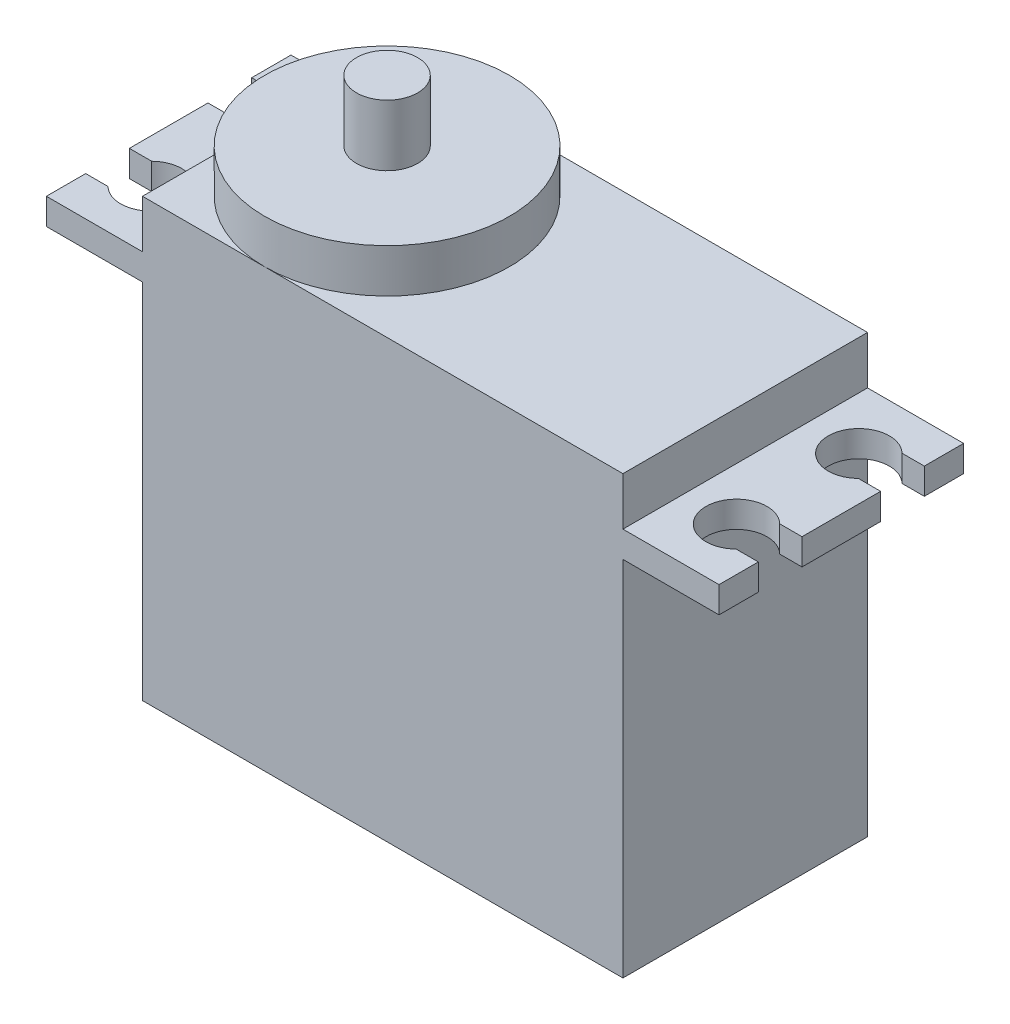
ISO-10303-21;
HEADER;
FILE_DESCRIPTION(('STEP AP214'),'2;1');
FILE_NAME('part.step','',(''),(''),'','','');
FILE_SCHEMA(('AUTOMOTIVE_DESIGN { 1 0 10303 214 1 1 1 1 }'));
ENDSEC;
DATA;
#1=APPLICATION_CONTEXT('core data for automotive mechanical design processes');
#2=APPLICATION_PROTOCOL_DEFINITION('international standard','automotive_design',2000,#1);
#3=PRODUCT_CONTEXT('',#1,'mechanical');
#4=PRODUCT('Part','Part','',(#3));
#5=PRODUCT_RELATED_PRODUCT_CATEGORY('part','',(#4));
#6=PRODUCT_DEFINITION_FORMATION('','',#4);
#7=PRODUCT_DEFINITION_CONTEXT('part definition',#1,'design');
#8=PRODUCT_DEFINITION('design','',#6,#7);
#9=PRODUCT_DEFINITION_SHAPE('','',#8);
#10=(LENGTH_UNIT() NAMED_UNIT(*) SI_UNIT(.MILLI.,.METRE.));
#11=(NAMED_UNIT(*) PLANE_ANGLE_UNIT() SI_UNIT($,.RADIAN.));
#12=(NAMED_UNIT(*) SI_UNIT($,.STERADIAN.) SOLID_ANGLE_UNIT());
#13=UNCERTAINTY_MEASURE_WITH_UNIT(LENGTH_MEASURE(1.E-05),#10,'distance_accuracy_value','');
#14=(GEOMETRIC_REPRESENTATION_CONTEXT(3) GLOBAL_UNCERTAINTY_ASSIGNED_CONTEXT((#13)) GLOBAL_UNIT_ASSIGNED_CONTEXT((#10,
#11,#12)) REPRESENTATION_CONTEXT('',''));
#15=CARTESIAN_POINT('',(0.,0.,0.));
#16=DIRECTION('',(0.,0.,1.));
#17=DIRECTION('',(1.,0.,0.));
#18=AXIS2_PLACEMENT_3D('',#15,#16,#17);
#19=CARTESIAN_POINT('',(-38.5,44.5,14.));
#20=DIRECTION('',(1.,0.,0.));
#21=DIRECTION('',(0.,0.,-1.));
#22=AXIS2_PLACEMENT_3D('',#19,#20,#21);
#23=PLANE('',#22);
#24=DIRECTION('',(0.,-1.,0.));
#25=VECTOR('',#24,1.);
#26=CARTESIAN_POINT('',(-38.5,44.5,-9.5));
#27=LINE('',#26,#25);
#28=CARTESIAN_POINT('',(-38.5,44.5,-9.5));
#29=VERTEX_POINT('',#28);
#30=CARTESIAN_POINT('',(-38.5,41.5,-9.5));
#31=VERTEX_POINT('',#30);
#32=EDGE_CURVE('E248',#29,#31,#27,.T.);
#33=ORIENTED_EDGE('',*,*,#32,.F.);
#34=DIRECTION('',(0.,0.,1.));
#35=VECTOR('',#34,1.);
#36=CARTESIAN_POINT('',(-38.5,44.5,14.));
#37=LINE('',#36,#35);
#38=CARTESIAN_POINT('',(-38.5,44.5,-14.));
#39=VERTEX_POINT('',#38);
#40=EDGE_CURVE('E253',#39,#29,#37,.T.);
#41=ORIENTED_EDGE('',*,*,#40,.F.);
#42=DIRECTION('',(0.,-1.,0.));
#43=VECTOR('',#42,1.);
#44=CARTESIAN_POINT('',(-38.5,44.5,-14.));
#45=LINE('',#44,#43);
#46=CARTESIAN_POINT('',(-38.5,41.5,-14.));
#47=VERTEX_POINT('',#46);
#48=EDGE_CURVE('E371',#39,#47,#45,.T.);
#49=ORIENTED_EDGE('',*,*,#48,.T.);
#50=DIRECTION('',(0.,0.,1.));
#51=VECTOR('',#50,1.);
#52=CARTESIAN_POINT('',(-38.5,41.5,14.));
#53=LINE('',#52,#51);
#54=EDGE_CURVE('E363',#47,#31,#53,.T.);
#55=ORIENTED_EDGE('',*,*,#54,.T.);
#56=EDGE_LOOP('',(#33,#41,#49,#55));
#57=FACE_BOUND('',#56,.T.);
#58=ADVANCED_FACE('F33',(#57),#23,.F.);
#59=DIRECTION('',(0.,-1.,0.));
#60=VECTOR('',#59,1.);
#61=CARTESIAN_POINT('',(-38.5,44.5,-4.5));
#62=LINE('',#61,#60);
#63=CARTESIAN_POINT('',(-38.5,44.5,-4.5));
#64=VERTEX_POINT('',#63);
#65=CARTESIAN_POINT('',(-38.5,41.5,-4.5));
#66=VERTEX_POINT('',#65);
#67=EDGE_CURVE('E263',#64,#66,#62,.T.);
#68=ORIENTED_EDGE('',*,*,#67,.T.);
#69=CARTESIAN_POINT('',(-38.5,41.5,4.5));
#70=VERTEX_POINT('',#69);
#71=EDGE_CURVE('E366',#66,#70,#53,.T.);
#72=ORIENTED_EDGE('',*,*,#71,.T.);
#73=DIRECTION('',(0.,-1.,0.));
#74=VECTOR('',#73,1.);
#75=CARTESIAN_POINT('',(-38.5,44.5,4.5));
#76=LINE('',#75,#74);
#77=CARTESIAN_POINT('',(-38.5,44.5,4.5));
#78=VERTEX_POINT('',#77);
#79=EDGE_CURVE('E286',#78,#70,#76,.T.);
#80=ORIENTED_EDGE('',*,*,#79,.F.);
#81=EDGE_CURVE('E355',#64,#78,#37,.T.);
#82=ORIENTED_EDGE('',*,*,#81,.F.);
#83=EDGE_LOOP('',(#68,#72,#80,#82));
#84=FACE_BOUND('',#83,.T.);
#85=ADVANCED_FACE('F549',(#84),#23,.F.);
#86=CARTESIAN_POINT('',(0.,44.5,0.));
#87=DIRECTION('',(0.,1.,0.));
#88=DIRECTION('',(0.,0.,1.));
#89=AXIS2_PLACEMENT_3D('',#86,#87,#88);
#90=PLANE('',#89);
#91=ORIENTED_EDGE('',*,*,#40,.T.);
#92=DIRECTION('',(-1.,0.,0.));
#93=VECTOR('',#92,1.);
#94=CARTESIAN_POINT('',(-35.9494897427832,44.5,-9.5));
#95=LINE('',#94,#93);
#96=CARTESIAN_POINT('',(-35.9494897427832,44.5,-9.5));
#97=VERTEX_POINT('',#96);
#98=EDGE_CURVE('E240',#97,#29,#95,.T.);
#99=ORIENTED_EDGE('',*,*,#98,.F.);
#100=CARTESIAN_POINT('',(-33.5,44.5,-7.));
#101=DIRECTION('',(0.,1.,0.));
#102=DIRECTION('',(0.,0.,-1.));
#103=AXIS2_PLACEMENT_3D('',#100,#101,#102);
#104=CIRCLE('',#103,3.5);
#105=CARTESIAN_POINT('',(-35.9494897427832,44.5,-4.5));
#106=VERTEX_POINT('',#105);
#107=EDGE_CURVE('E232',#106,#97,#104,.T.);
#108=ORIENTED_EDGE('',*,*,#107,.F.);
#109=DIRECTION('',(1.,0.,0.));
#110=VECTOR('',#109,1.);
#111=CARTESIAN_POINT('',(-35.9494897427832,44.5,-4.5));
#112=LINE('',#111,#110);
#113=EDGE_CURVE('E254',#64,#106,#112,.T.);
#114=ORIENTED_EDGE('',*,*,#113,.F.);
#115=ORIENTED_EDGE('',*,*,#81,.T.);
#116=DIRECTION('',(-1.,0.,0.));
#117=VECTOR('',#116,1.);
#118=CARTESIAN_POINT('',(-35.9494897427832,44.5,4.5));
#119=LINE('',#118,#117);
#120=CARTESIAN_POINT('',(-35.9494897427832,44.5,4.5));
#121=VERTEX_POINT('',#120);
#122=EDGE_CURVE('E269',#121,#78,#119,.T.);
#123=ORIENTED_EDGE('',*,*,#122,.F.);
#124=CARTESIAN_POINT('',(-33.5,44.5,7.));
#125=DIRECTION('',(0.,1.,0.));
#126=DIRECTION('',(0.,0.,1.));
#127=AXIS2_PLACEMENT_3D('',#124,#125,#126);
#128=CIRCLE('',#127,3.5);
#129=CARTESIAN_POINT('',(-35.9494897427832,44.5,9.5));
#130=VERTEX_POINT('',#129);
#131=EDGE_CURVE('E267',#130,#121,#128,.T.);
#132=ORIENTED_EDGE('',*,*,#131,.F.);
#133=DIRECTION('',(1.,0.,0.));
#134=VECTOR('',#133,1.);
#135=CARTESIAN_POINT('',(-35.9494897427832,44.5,9.5));
#136=LINE('',#135,#134);
#137=CARTESIAN_POINT('',(-38.5,44.5,9.5));
#138=VERTEX_POINT('',#137);
#139=EDGE_CURVE('E273',#138,#130,#136,.T.);
#140=ORIENTED_EDGE('',*,*,#139,.F.);
#141=CARTESIAN_POINT('',(-38.5,44.5,14.));
#142=VERTEX_POINT('',#141);
#143=EDGE_CURVE('E352',#138,#142,#37,.T.);
#144=ORIENTED_EDGE('',*,*,#143,.T.);
#145=DIRECTION('',(1.,0.,0.));
#146=VECTOR('',#145,1.);
#147=CARTESIAN_POINT('',(-27.5,44.5,14.));
#148=LINE('',#147,#146);
#149=CARTESIAN_POINT('',(-27.5,44.5,14.));
#150=VERTEX_POINT('',#149);
#151=EDGE_CURVE('E354',#142,#150,#148,.T.);
#152=ORIENTED_EDGE('',*,*,#151,.T.);
#153=DIRECTION('',(0.,0.,-1.));
#154=VECTOR('',#153,1.);
#155=CARTESIAN_POINT('',(-27.5,44.5,14.));
#156=LINE('',#155,#154);
#157=CARTESIAN_POINT('',(-27.5,44.5,-14.));
#158=VERTEX_POINT('',#157);
#159=EDGE_CURVE('E346',#150,#158,#156,.T.);
#160=ORIENTED_EDGE('',*,*,#159,.T.);
#161=DIRECTION('',(-1.,0.,0.));
#162=VECTOR('',#161,1.);
#163=CARTESIAN_POINT('',(-27.5,44.5,-14.));
#164=LINE('',#163,#162);
#165=EDGE_CURVE('E349',#158,#39,#164,.T.);
#166=ORIENTED_EDGE('',*,*,#165,.T.);
#167=EDGE_LOOP('',(#91,#99,#108,#114,#115,#123,#132,#140,#144,#152,#160,#166));
#168=FACE_BOUND('',#167,.T.);
#169=ADVANCED_FACE('F251',(#168),#90,.T.);
#170=CARTESIAN_POINT('',(0.,41.5,0.));
#171=DIRECTION('',(0.,1.,0.));
#172=DIRECTION('',(0.,0.,1.));
#173=AXIS2_PLACEMENT_3D('',#170,#171,#172);
#174=PLANE('',#173);
#175=DIRECTION('',(-1.,0.,0.));
#176=VECTOR('',#175,1.);
#177=CARTESIAN_POINT('',(-35.9494897427832,41.5,-9.5));
#178=LINE('',#177,#176);
#179=CARTESIAN_POINT('',(-35.9494897427832,41.5,-9.5));
#180=VERTEX_POINT('',#179);
#181=EDGE_CURVE('E247',#180,#31,#178,.T.);
#182=ORIENTED_EDGE('',*,*,#181,.T.);
#183=ORIENTED_EDGE('',*,*,#54,.F.);
#184=DIRECTION('',(-1.,0.,0.));
#185=VECTOR('',#184,1.);
#186=CARTESIAN_POINT('',(-27.5,41.5,-14.));
#187=LINE('',#186,#185);
#188=CARTESIAN_POINT('',(-27.5,41.5,-14.));
#189=VERTEX_POINT('',#188);
#190=EDGE_CURVE('E360',#189,#47,#187,.T.);
#191=ORIENTED_EDGE('',*,*,#190,.F.);
#192=DIRECTION('',(0.,0.,-1.));
#193=VECTOR('',#192,1.);
#194=CARTESIAN_POINT('',(-27.5,41.5,14.));
#195=LINE('',#194,#193);
#196=CARTESIAN_POINT('',(-27.5,41.5,14.));
#197=VERTEX_POINT('',#196);
#198=EDGE_CURVE('E345',#197,#189,#195,.T.);
#199=ORIENTED_EDGE('',*,*,#198,.F.);
#200=DIRECTION('',(1.,0.,0.));
#201=VECTOR('',#200,1.);
#202=CARTESIAN_POINT('',(-27.5,41.5,14.));
#203=LINE('',#202,#201);
#204=CARTESIAN_POINT('',(-38.5,41.5,14.));
#205=VERTEX_POINT('',#204);
#206=EDGE_CURVE('E350',#205,#197,#203,.T.);
#207=ORIENTED_EDGE('',*,*,#206,.F.);
#208=CARTESIAN_POINT('',(-38.5,41.5,9.5));
#209=VERTEX_POINT('',#208);
#210=EDGE_CURVE('E362',#209,#205,#53,.T.);
#211=ORIENTED_EDGE('',*,*,#210,.F.);
#212=DIRECTION('',(1.,0.,0.));
#213=VECTOR('',#212,1.);
#214=CARTESIAN_POINT('',(-35.9494897427832,41.5,9.5));
#215=LINE('',#214,#213);
#216=CARTESIAN_POINT('',(-35.9494897427832,41.5,9.5));
#217=VERTEX_POINT('',#216);
#218=EDGE_CURVE('E270',#209,#217,#215,.T.);
#219=ORIENTED_EDGE('',*,*,#218,.T.);
#220=CARTESIAN_POINT('',(-33.5,41.5,7.));
#221=DIRECTION('',(0.,1.,0.));
#222=DIRECTION('',(0.,0.,1.));
#223=AXIS2_PLACEMENT_3D('',#220,#221,#222);
#224=CIRCLE('',#223,3.5);
#225=CARTESIAN_POINT('',(-35.9494897427832,41.5,4.5));
#226=VERTEX_POINT('',#225);
#227=EDGE_CURVE('E59',#217,#226,#224,.T.);
#228=ORIENTED_EDGE('',*,*,#227,.T.);
#229=DIRECTION('',(-1.,0.,0.));
#230=VECTOR('',#229,1.);
#231=CARTESIAN_POINT('',(-35.9494897427832,41.5,4.5));
#232=LINE('',#231,#230);
#233=EDGE_CURVE('E277',#226,#70,#232,.T.);
#234=ORIENTED_EDGE('',*,*,#233,.T.);
#235=ORIENTED_EDGE('',*,*,#71,.F.);
#236=DIRECTION('',(1.,0.,0.));
#237=VECTOR('',#236,1.);
#238=CARTESIAN_POINT('',(-35.9494897427832,41.5,-4.5));
#239=LINE('',#238,#237);
#240=CARTESIAN_POINT('',(-35.9494897427832,41.5,-4.5));
#241=VERTEX_POINT('',#240);
#242=EDGE_CURVE('E241',#66,#241,#239,.T.);
#243=ORIENTED_EDGE('',*,*,#242,.T.);
#244=CARTESIAN_POINT('',(-33.5,41.5,-7.));
#245=DIRECTION('',(0.,1.,0.));
#246=DIRECTION('',(0.,0.,-1.));
#247=AXIS2_PLACEMENT_3D('',#244,#245,#246);
#248=CIRCLE('',#247,3.5);
#249=EDGE_CURVE('E51',#241,#180,#248,.T.);
#250=ORIENTED_EDGE('',*,*,#249,.T.);
#251=EDGE_LOOP('',(#182,#183,#191,#199,#207,#211,#219,#228,#234,#235,#243,#250));
#252=FACE_BOUND('',#251,.T.);
#253=ADVANCED_FACE('F560',(#252),#174,.F.);
#254=DIRECTION('',(0.,-1.,0.));
#255=VECTOR('',#254,1.);
#256=CARTESIAN_POINT('',(-38.5,44.5,9.5));
#257=LINE('',#256,#255);
#258=EDGE_CURVE('E283',#138,#209,#257,.T.);
#259=ORIENTED_EDGE('',*,*,#258,.T.);
#260=ORIENTED_EDGE('',*,*,#210,.T.);
#261=DIRECTION('',(0.,-1.,0.));
#262=VECTOR('',#261,1.);
#263=CARTESIAN_POINT('',(-38.5,44.5,14.));
#264=LINE('',#263,#262);
#265=EDGE_CURVE('E357',#142,#205,#264,.T.);
#266=ORIENTED_EDGE('',*,*,#265,.F.);
#267=ORIENTED_EDGE('',*,*,#143,.F.);
#268=EDGE_LOOP('',(#259,#260,#266,#267));
#269=FACE_BOUND('',#268,.T.);
#270=ADVANCED_FACE('F552',(#269),#23,.F.);
#271=CARTESIAN_POINT('',(38.5,44.5,-14.));
#272=DIRECTION('',(-1.,0.,0.));
#273=DIRECTION('',(0.,0.,1.));
#274=AXIS2_PLACEMENT_3D('',#271,#272,#273);
#275=PLANE('',#274);
#276=DIRECTION('',(0.,-1.,0.));
#277=VECTOR('',#276,1.);
#278=CARTESIAN_POINT('',(38.5,44.5,9.5));
#279=LINE('',#278,#277);
#280=CARTESIAN_POINT('',(38.5,44.5,9.5));
#281=VERTEX_POINT('',#280);
#282=CARTESIAN_POINT('',(38.5,41.5,9.5));
#283=VERTEX_POINT('',#282);
#284=EDGE_CURVE('E312',#281,#283,#279,.T.);
#285=ORIENTED_EDGE('',*,*,#284,.F.);
#286=DIRECTION('',(0.,0.,-1.));
#287=VECTOR('',#286,1.);
#288=CARTESIAN_POINT('',(38.5,44.5,-14.));
#289=LINE('',#288,#287);
#290=CARTESIAN_POINT('',(38.5,44.5,14.));
#291=VERTEX_POINT('',#290);
#292=EDGE_CURVE('E377',#291,#281,#289,.T.);
#293=ORIENTED_EDGE('',*,*,#292,.F.);
#294=DIRECTION('',(0.,-1.,0.));
#295=VECTOR('',#294,1.);
#296=CARTESIAN_POINT('',(38.5,44.5,14.));
#297=LINE('',#296,#295);
#298=CARTESIAN_POINT('',(38.5,41.5,14.));
#299=VERTEX_POINT('',#298);
#300=EDGE_CURVE('E408',#291,#299,#297,.T.);
#301=ORIENTED_EDGE('',*,*,#300,.T.);
#302=DIRECTION('',(0.,0.,-1.));
#303=VECTOR('',#302,1.);
#304=CARTESIAN_POINT('',(38.5,41.5,-14.));
#305=LINE('',#304,#303);
#306=EDGE_CURVE('E396',#299,#283,#305,.T.);
#307=ORIENTED_EDGE('',*,*,#306,.T.);
#308=EDGE_LOOP('',(#285,#293,#301,#307));
#309=FACE_BOUND('',#308,.T.);
#310=ADVANCED_FACE('F528',(#309),#275,.F.);
#311=DIRECTION('',(0.,-1.,0.));
#312=VECTOR('',#311,1.);
#313=CARTESIAN_POINT('',(38.5,44.5,4.5));
#314=LINE('',#313,#312);
#315=CARTESIAN_POINT('',(38.5,44.5,4.5));
#316=VERTEX_POINT('',#315);
#317=CARTESIAN_POINT('',(38.5,41.5,4.5));
#318=VERTEX_POINT('',#317);
#319=EDGE_CURVE('E309',#316,#318,#314,.T.);
#320=ORIENTED_EDGE('',*,*,#319,.T.);
#321=CARTESIAN_POINT('',(38.5,41.5,-4.5));
#322=VERTEX_POINT('',#321);
#323=EDGE_CURVE('E404',#318,#322,#305,.T.);
#324=ORIENTED_EDGE('',*,*,#323,.T.);
#325=DIRECTION('',(0.,-1.,0.));
#326=VECTOR('',#325,1.);
#327=CARTESIAN_POINT('',(38.5,44.5,-4.5));
#328=LINE('',#327,#326);
#329=CARTESIAN_POINT('',(38.5,44.5,-4.5));
#330=VERTEX_POINT('',#329);
#331=EDGE_CURVE('E339',#330,#322,#328,.T.);
#332=ORIENTED_EDGE('',*,*,#331,.F.);
#333=EDGE_CURVE('E521',#316,#330,#289,.T.);
#334=ORIENTED_EDGE('',*,*,#333,.F.);
#335=EDGE_LOOP('',(#320,#324,#332,#334));
#336=FACE_BOUND('',#335,.T.);
#337=ADVANCED_FACE('F501',(#336),#275,.F.);
#338=CARTESIAN_POINT('',(0.,44.5,0.));
#339=DIRECTION('',(0.,1.,0.));
#340=DIRECTION('',(0.,0.,1.));
#341=AXIS2_PLACEMENT_3D('',#338,#339,#340);
#342=PLANE('',#341);
#343=ORIENTED_EDGE('',*,*,#292,.T.);
#344=DIRECTION('',(1.,0.,0.));
#345=VECTOR('',#344,1.);
#346=CARTESIAN_POINT('',(35.9494897427832,44.5,9.5));
#347=LINE('',#346,#345);
#348=CARTESIAN_POINT('',(35.9494897427832,44.5,9.5));
#349=VERTEX_POINT('',#348);
#350=EDGE_CURVE('E294',#349,#281,#347,.T.);
#351=ORIENTED_EDGE('',*,*,#350,.F.);
#352=CARTESIAN_POINT('',(33.5,44.5,7.));
#353=DIRECTION('',(0.,1.,0.));
#354=DIRECTION('',(0.,0.,-1.));
#355=AXIS2_PLACEMENT_3D('',#352,#353,#354);
#356=CIRCLE('',#355,3.5);
#357=CARTESIAN_POINT('',(35.9494897427832,44.5,4.5));
#358=VERTEX_POINT('',#357);
#359=EDGE_CURVE('E292',#358,#349,#356,.T.);
#360=ORIENTED_EDGE('',*,*,#359,.F.);
#361=DIRECTION('',(-1.,0.,0.));
#362=VECTOR('',#361,1.);
#363=CARTESIAN_POINT('',(35.9494897427832,44.5,4.5));
#364=LINE('',#363,#362);
#365=EDGE_CURVE('E297',#316,#358,#364,.T.);
#366=ORIENTED_EDGE('',*,*,#365,.F.);
#367=ORIENTED_EDGE('',*,*,#333,.T.);
#368=DIRECTION('',(1.,0.,0.));
#369=VECTOR('',#368,1.);
#370=CARTESIAN_POINT('',(35.9494897427832,44.5,-4.5));
#371=LINE('',#370,#369);
#372=CARTESIAN_POINT('',(35.9494897427832,44.5,-4.5));
#373=VERTEX_POINT('',#372);
#374=EDGE_CURVE('E320',#373,#330,#371,.T.);
#375=ORIENTED_EDGE('',*,*,#374,.F.);
#376=CARTESIAN_POINT('',(33.5,44.5,-7.));
#377=DIRECTION('',(0.,1.,0.));
#378=DIRECTION('',(0.,0.,1.));
#379=AXIS2_PLACEMENT_3D('',#376,#377,#378);
#380=CIRCLE('',#379,3.5);
#381=CARTESIAN_POINT('',(35.9494897427832,44.5,-9.5));
#382=VERTEX_POINT('',#381);
#383=EDGE_CURVE('E318',#382,#373,#380,.T.);
#384=ORIENTED_EDGE('',*,*,#383,.F.);
#385=DIRECTION('',(-1.,0.,0.));
#386=VECTOR('',#385,1.);
#387=CARTESIAN_POINT('',(35.9494897427832,44.5,-9.5));
#388=LINE('',#387,#386);
#389=CARTESIAN_POINT('',(38.5,44.5,-9.5));
#390=VERTEX_POINT('',#389);
#391=EDGE_CURVE('E324',#390,#382,#388,.T.);
#392=ORIENTED_EDGE('',*,*,#391,.F.);
#393=CARTESIAN_POINT('',(38.5,44.5,-14.));
#394=VERTEX_POINT('',#393);
#395=EDGE_CURVE('E518',#390,#394,#289,.T.);
#396=ORIENTED_EDGE('',*,*,#395,.T.);
#397=DIRECTION('',(-1.,0.,0.));
#398=VECTOR('',#397,1.);
#399=CARTESIAN_POINT('',(27.5,44.5,-14.));
#400=LINE('',#399,#398);
#401=CARTESIAN_POINT('',(27.5,44.5,-14.));
#402=VERTEX_POINT('',#401);
#403=EDGE_CURVE('E388',#394,#402,#400,.T.);
#404=ORIENTED_EDGE('',*,*,#403,.T.);
#405=DIRECTION('',(0.,0.,1.));
#406=VECTOR('',#405,1.);
#407=CARTESIAN_POINT('',(27.5,44.5,-14.));
#408=LINE('',#407,#406);
#409=CARTESIAN_POINT('',(27.5,44.5,14.));
#410=VERTEX_POINT('',#409);
#411=EDGE_CURVE('E380',#402,#410,#408,.T.);
#412=ORIENTED_EDGE('',*,*,#411,.T.);
#413=DIRECTION('',(1.,0.,0.));
#414=VECTOR('',#413,1.);
#415=CARTESIAN_POINT('',(27.5,44.5,14.));
#416=LINE('',#415,#414);
#417=EDGE_CURVE('E384',#410,#291,#416,.T.);
#418=ORIENTED_EDGE('',*,*,#417,.T.);
#419=EDGE_LOOP('',(#343,#351,#360,#366,#367,#375,#384,#392,#396,#404,#412,#418));
#420=FACE_BOUND('',#419,.T.);
#421=ADVANCED_FACE('F517',(#420),#342,.T.);
#422=CARTESIAN_POINT('',(0.,41.5,0.));
#423=DIRECTION('',(0.,1.,0.));
#424=DIRECTION('',(0.,0.,1.));
#425=AXIS2_PLACEMENT_3D('',#422,#423,#424);
#426=PLANE('',#425);
#427=DIRECTION('',(1.,0.,0.));
#428=VECTOR('',#427,1.);
#429=CARTESIAN_POINT('',(35.9494897427832,41.5,9.5));
#430=LINE('',#429,#428);
#431=CARTESIAN_POINT('',(35.9494897427832,41.5,9.5));
#432=VERTEX_POINT('',#431);
#433=EDGE_CURVE('E302',#432,#283,#430,.T.);
#434=ORIENTED_EDGE('',*,*,#433,.T.);
#435=ORIENTED_EDGE('',*,*,#306,.F.);
#436=DIRECTION('',(1.,0.,0.));
#437=VECTOR('',#436,1.);
#438=CARTESIAN_POINT('',(27.5,41.5,14.));
#439=LINE('',#438,#437);
#440=CARTESIAN_POINT('',(27.5,41.5,14.));
#441=VERTEX_POINT('',#440);
#442=EDGE_CURVE('E399',#441,#299,#439,.T.);
#443=ORIENTED_EDGE('',*,*,#442,.F.);
#444=DIRECTION('',(0.,0.,1.));
#445=VECTOR('',#444,1.);
#446=CARTESIAN_POINT('',(27.5,41.5,-14.));
#447=LINE('',#446,#445);
#448=CARTESIAN_POINT('',(27.5,41.5,-14.));
#449=VERTEX_POINT('',#448);
#450=EDGE_CURVE('E374',#449,#441,#447,.T.);
#451=ORIENTED_EDGE('',*,*,#450,.F.);
#452=DIRECTION('',(-1.,0.,0.));
#453=VECTOR('',#452,1.);
#454=CARTESIAN_POINT('',(27.5,41.5,-14.));
#455=LINE('',#454,#453);
#456=CARTESIAN_POINT('',(38.5,41.5,-14.));
#457=VERTEX_POINT('',#456);
#458=EDGE_CURVE('E385',#457,#449,#455,.T.);
#459=ORIENTED_EDGE('',*,*,#458,.F.);
#460=CARTESIAN_POINT('',(38.5,41.5,-9.5));
#461=VERTEX_POINT('',#460);
#462=EDGE_CURVE('E405',#461,#457,#305,.T.);
#463=ORIENTED_EDGE('',*,*,#462,.F.);
#464=DIRECTION('',(-1.,0.,0.));
#465=VECTOR('',#464,1.);
#466=CARTESIAN_POINT('',(35.9494897427832,41.5,-9.5));
#467=LINE('',#466,#465);
#468=CARTESIAN_POINT('',(35.9494897427832,41.5,-9.5));
#469=VERTEX_POINT('',#468);
#470=EDGE_CURVE('E321',#461,#469,#467,.T.);
#471=ORIENTED_EDGE('',*,*,#470,.T.);
#472=CARTESIAN_POINT('',(33.5,41.5,-7.));
#473=DIRECTION('',(0.,1.,0.));
#474=DIRECTION('',(0.,0.,1.));
#475=AXIS2_PLACEMENT_3D('',#472,#473,#474);
#476=CIRCLE('',#475,3.5);
#477=CARTESIAN_POINT('',(35.9494897427832,41.5,-4.5));
#478=VERTEX_POINT('',#477);
#479=EDGE_CURVE('E317',#469,#478,#476,.T.);
#480=ORIENTED_EDGE('',*,*,#479,.T.);
#481=DIRECTION('',(1.,0.,0.));
#482=VECTOR('',#481,1.);
#483=CARTESIAN_POINT('',(35.9494897427832,41.5,-4.5));
#484=LINE('',#483,#482);
#485=EDGE_CURVE('E329',#478,#322,#484,.T.);
#486=ORIENTED_EDGE('',*,*,#485,.T.);
#487=ORIENTED_EDGE('',*,*,#323,.F.);
#488=DIRECTION('',(-1.,0.,0.));
#489=VECTOR('',#488,1.);
#490=CARTESIAN_POINT('',(35.9494897427832,41.5,4.5));
#491=LINE('',#490,#489);
#492=CARTESIAN_POINT('',(35.9494897427832,41.5,4.5));
#493=VERTEX_POINT('',#492);
#494=EDGE_CURVE('E295',#318,#493,#491,.T.);
#495=ORIENTED_EDGE('',*,*,#494,.T.);
#496=CARTESIAN_POINT('',(33.5,41.5,7.));
#497=DIRECTION('',(0.,1.,0.));
#498=DIRECTION('',(0.,0.,-1.));
#499=AXIS2_PLACEMENT_3D('',#496,#497,#498);
#500=CIRCLE('',#499,3.5);
#501=EDGE_CURVE('E291',#493,#432,#500,.T.);
#502=ORIENTED_EDGE('',*,*,#501,.T.);
#503=EDGE_LOOP('',(#434,#435,#443,#451,#459,#463,#471,#480,#486,#487,#495,#502));
#504=FACE_BOUND('',#503,.T.);
#505=ADVANCED_FACE('F493',(#504),#426,.F.);
#506=DIRECTION('',(0.,-1.,0.));
#507=VECTOR('',#506,1.);
#508=CARTESIAN_POINT('',(38.5,44.5,-9.5));
#509=LINE('',#508,#507);
#510=EDGE_CURVE('E336',#390,#461,#509,.T.);
#511=ORIENTED_EDGE('',*,*,#510,.T.);
#512=ORIENTED_EDGE('',*,*,#462,.T.);
#513=DIRECTION('',(0.,-1.,0.));
#514=VECTOR('',#513,1.);
#515=CARTESIAN_POINT('',(38.5,44.5,-14.));
#516=LINE('',#515,#514);
#517=EDGE_CURVE('E391',#394,#457,#516,.T.);
#518=ORIENTED_EDGE('',*,*,#517,.F.);
#519=ORIENTED_EDGE('',*,*,#395,.F.);
#520=EDGE_LOOP('',(#511,#512,#518,#519));
#521=FACE_BOUND('',#520,.T.);
#522=ADVANCED_FACE('F519',(#521),#275,.F.);
#523=CARTESIAN_POINT('',(-27.5,50.,14.));
#524=DIRECTION('',(-1.,0.,0.));
#525=DIRECTION('',(0.,0.,1.));
#526=AXIS2_PLACEMENT_3D('',#523,#524,#525);
#527=PLANE('',#526);
#528=DIRECTION('',(0.,-1.,0.));
#529=VECTOR('',#528,1.);
#530=CARTESIAN_POINT('',(-27.5,50.,14.));
#531=LINE('',#530,#529);
#532=CARTESIAN_POINT('',(-27.5,0.,14.));
#533=VERTEX_POINT('',#532);
#534=EDGE_CURVE('E457',#197,#533,#531,.T.);
#535=ORIENTED_EDGE('',*,*,#534,.F.);
#536=ORIENTED_EDGE('',*,*,#198,.T.);
#537=DIRECTION('',(0.,-1.,0.));
#538=VECTOR('',#537,1.);
#539=CARTESIAN_POINT('',(-27.5,50.,-14.));
#540=LINE('',#539,#538);
#541=CARTESIAN_POINT('',(-27.5,0.,-14.));
#542=VERTEX_POINT('',#541);
#543=EDGE_CURVE('E466',#189,#542,#540,.T.);
#544=ORIENTED_EDGE('',*,*,#543,.T.);
#545=DIRECTION('',(0.,0.,-1.));
#546=VECTOR('',#545,1.);
#547=CARTESIAN_POINT('',(-27.5,0.,14.));
#548=LINE('',#547,#546);
#549=EDGE_CURVE('E443',#533,#542,#548,.T.);
#550=ORIENTED_EDGE('',*,*,#549,.F.);
#551=EDGE_LOOP('',(#535,#536,#544,#550));
#552=FACE_BOUND('',#551,.T.);
#553=ADVANCED_FACE('F482',(#552),#527,.T.);
#554=CARTESIAN_POINT('',(27.5,50.,14.));
#555=DIRECTION('',(-1.,0.,0.));
#556=DIRECTION('',(0.,0.,1.));
#557=AXIS2_PLACEMENT_3D('',#554,#555,#556);
#558=PLANE('',#557);
#559=ORIENTED_EDGE('',*,*,#411,.F.);
#560=DIRECTION('',(0.,-1.,0.));
#561=VECTOR('',#560,1.);
#562=CARTESIAN_POINT('',(27.5,50.,-14.));
#563=LINE('',#562,#561);
#564=CARTESIAN_POINT('',(27.5,50.,-14.));
#565=VERTEX_POINT('',#564);
#566=EDGE_CURVE('E461',#565,#402,#563,.T.);
#567=ORIENTED_EDGE('',*,*,#566,.F.);
#568=DIRECTION('',(0.,0.,-1.));
#569=VECTOR('',#568,1.);
#570=CARTESIAN_POINT('',(27.5,50.,14.));
#571=LINE('',#570,#569);
#572=CARTESIAN_POINT('',(27.5,50.,14.));
#573=VERTEX_POINT('',#572);
#574=EDGE_CURVE('E422',#573,#565,#571,.T.);
#575=ORIENTED_EDGE('',*,*,#574,.F.);
#576=DIRECTION('',(0.,-1.,0.));
#577=VECTOR('',#576,1.);
#578=CARTESIAN_POINT('',(27.5,50.,14.));
#579=LINE('',#578,#577);
#580=EDGE_CURVE('E455',#573,#410,#579,.T.);
#581=ORIENTED_EDGE('',*,*,#580,.T.);
#582=EDGE_LOOP('',(#559,#567,#575,#581));
#583=FACE_BOUND('',#582,.T.);
#584=ADVANCED_FACE('F604',(#583),#558,.F.);
#585=CARTESIAN_POINT('',(-13.5,55.,0.));
#586=DIRECTION('',(0.,1.,0.));
#587=DIRECTION('',(0.,0.,1.));
#588=AXIS2_PLACEMENT_3D('',#585,#586,#587);
#589=PLANE('',#588);
#590=CARTESIAN_POINT('',(-13.5,55.,0.));
#591=DIRECTION('',(0.,1.,0.));
#592=DIRECTION('',(0.,0.,1.));
#593=AXIS2_PLACEMENT_3D('',#590,#591,#592);
#594=CIRCLE('',#593,14.);
#595=CARTESIAN_POINT('',(-13.5,55.,14.));
#596=VERTEX_POINT('',#595);
#597=EDGE_CURVE('E417',#596,#596,#594,.T.);
#598=ORIENTED_EDGE('',*,*,#597,.T.);
#599=EDGE_LOOP('',(#598));
#600=FACE_BOUND('',#599,.T.);
#601=CARTESIAN_POINT('',(-13.5,55.,0.));
#602=DIRECTION('',(0.,1.,0.));
#603=DIRECTION('',(0.,0.,1.));
#604=AXIS2_PLACEMENT_3D('',#601,#602,#603);
#605=CIRCLE('',#604,3.5);
#606=CARTESIAN_POINT('',(-13.5,55.,3.5));
#607=VERTEX_POINT('',#606);
#608=EDGE_CURVE('E411',#607,#607,#605,.T.);
#609=ORIENTED_EDGE('',*,*,#608,.F.);
#610=EDGE_LOOP('',(#609));
#611=FACE_BOUND('',#610,.T.);
#612=ADVANCED_FACE('F635',(#600,#611),#589,.T.);
#613=CARTESIAN_POINT('',(0.,50.,0.));
#614=DIRECTION('',(0.,1.,0.));
#615=DIRECTION('',(0.,0.,1.));
#616=AXIS2_PLACEMENT_3D('',#613,#614,#615);
#617=PLANE('',#616);
#618=CARTESIAN_POINT('',(-13.5,50.,0.));
#619=DIRECTION('',(0.,1.,0.));
#620=DIRECTION('',(0.,0.,1.));
#621=AXIS2_PLACEMENT_3D('',#618,#619,#620);
#622=CIRCLE('',#621,14.);
#623=CARTESIAN_POINT('',(-13.5,50.,14.));
#624=VERTEX_POINT('',#623);
#625=CARTESIAN_POINT('',(-13.5,50.,-14.));
#626=VERTEX_POINT('',#625);
#627=EDGE_CURVE('E44',#624,#626,#622,.T.);
#628=ORIENTED_EDGE('',*,*,#627,.F.);
#629=DIRECTION('',(-1.,0.,0.));
#630=VECTOR('',#629,1.);
#631=CARTESIAN_POINT('',(27.5,50.,14.));
#632=LINE('',#631,#630);
#633=EDGE_CURVE('E435',#573,#624,#632,.T.);
#634=ORIENTED_EDGE('',*,*,#633,.F.);
#635=ORIENTED_EDGE('',*,*,#574,.T.);
#636=DIRECTION('',(-1.,0.,0.));
#637=VECTOR('',#636,1.);
#638=CARTESIAN_POINT('',(27.5,50.,-14.));
#639=LINE('',#638,#637);
#640=EDGE_CURVE('E427',#565,#626,#639,.T.);
#641=ORIENTED_EDGE('',*,*,#640,.T.);
#642=EDGE_LOOP('',(#628,#634,#635,#641));
#643=FACE_BOUND('',#642,.T.);
#644=ADVANCED_FACE('F615',(#643),#617,.T.);
#645=CARTESIAN_POINT('',(-27.5,50.,0.));
#646=VERTEX_POINT('',#645);
#647=EDGE_CURVE('E11',#626,#646,#622,.T.);
#648=ORIENTED_EDGE('',*,*,#647,.F.);
#649=CARTESIAN_POINT('',(-27.5,50.,-14.));
#650=VERTEX_POINT('',#649);
#651=EDGE_CURVE('E425',#626,#650,#639,.T.);
#652=ORIENTED_EDGE('',*,*,#651,.T.);
#653=DIRECTION('',(0.,0.,-1.));
#654=VECTOR('',#653,1.);
#655=CARTESIAN_POINT('',(-27.5,50.,14.));
#656=LINE('',#655,#654);
#657=EDGE_CURVE('E430',#646,#650,#656,.T.);
#658=ORIENTED_EDGE('',*,*,#657,.F.);
#659=EDGE_LOOP('',(#648,#652,#658));
#660=FACE_BOUND('',#659,.T.);
#661=ADVANCED_FACE('F621',(#660),#617,.T.);
#662=CARTESIAN_POINT('',(27.5,0.,-14.));
#663=VERTEX_POINT('',#662);
#664=EDGE_CURVE('E458',#449,#663,#563,.T.);
#665=ORIENTED_EDGE('',*,*,#664,.F.);
#666=ORIENTED_EDGE('',*,*,#450,.T.);
#667=CARTESIAN_POINT('',(27.5,0.,14.));
#668=VERTEX_POINT('',#667);
#669=EDGE_CURVE('E437',#441,#668,#579,.T.);
#670=ORIENTED_EDGE('',*,*,#669,.T.);
#671=DIRECTION('',(0.,0.,-1.));
#672=VECTOR('',#671,1.);
#673=CARTESIAN_POINT('',(27.5,0.,14.));
#674=LINE('',#673,#672);
#675=EDGE_CURVE('E419',#668,#663,#674,.T.);
#676=ORIENTED_EDGE('',*,*,#675,.T.);
#677=EDGE_LOOP('',(#665,#666,#670,#676));
#678=FACE_BOUND('',#677,.T.);
#679=ADVANCED_FACE('F35',(#678),#558,.F.);
#680=CARTESIAN_POINT('',(27.5,50.,-14.));
#681=DIRECTION('',(0.,0.,1.));
#682=DIRECTION('',(1.,0.,0.));
#683=AXIS2_PLACEMENT_3D('',#680,#681,#682);
#684=PLANE('',#683);
#685=DIRECTION('',(-1.,0.,0.));
#686=VECTOR('',#685,1.);
#687=CARTESIAN_POINT('',(27.5,0.,-14.));
#688=LINE('',#687,#686);
#689=EDGE_CURVE('E440',#663,#542,#688,.T.);
#690=ORIENTED_EDGE('',*,*,#689,.T.);
#691=ORIENTED_EDGE('',*,*,#543,.F.);
#692=ORIENTED_EDGE('',*,*,#190,.T.);
#693=ORIENTED_EDGE('',*,*,#48,.F.);
#694=ORIENTED_EDGE('',*,*,#165,.F.);
#695=EDGE_CURVE('E462',#650,#158,#540,.T.);
#696=ORIENTED_EDGE('',*,*,#695,.F.);
#697=ORIENTED_EDGE('',*,*,#651,.F.);
#698=ORIENTED_EDGE('',*,*,#640,.F.);
#699=ORIENTED_EDGE('',*,*,#566,.T.);
#700=ORIENTED_EDGE('',*,*,#403,.F.);
#701=ORIENTED_EDGE('',*,*,#517,.T.);
#702=ORIENTED_EDGE('',*,*,#458,.T.);
#703=ORIENTED_EDGE('',*,*,#664,.T.);
#704=EDGE_LOOP('',(#690,#691,#692,#693,#694,#696,#697,#698,#699,#700,#701,#702,#703));
#705=FACE_BOUND('',#704,.T.);
#706=ADVANCED_FACE('F600',(#705),#684,.F.);
#707=ORIENTED_EDGE('',*,*,#159,.F.);
#708=CARTESIAN_POINT('',(-27.5,50.,14.));
#709=VERTEX_POINT('',#708);
#710=EDGE_CURVE('E450',#709,#150,#531,.T.);
#711=ORIENTED_EDGE('',*,*,#710,.F.);
#712=EDGE_CURVE('E431',#709,#646,#656,.T.);
#713=ORIENTED_EDGE('',*,*,#712,.T.);
#714=ORIENTED_EDGE('',*,*,#657,.T.);
#715=ORIENTED_EDGE('',*,*,#695,.T.);
#716=EDGE_LOOP('',(#707,#711,#713,#714,#715));
#717=FACE_BOUND('',#716,.T.);
#718=ADVANCED_FACE('F622',(#717),#527,.T.);
#719=CARTESIAN_POINT('',(27.5,50.,14.));
#720=DIRECTION('',(0.,0.,1.));
#721=DIRECTION('',(1.,0.,0.));
#722=AXIS2_PLACEMENT_3D('',#719,#720,#721);
#723=PLANE('',#722);
#724=DIRECTION('',(-1.,0.,0.));
#725=VECTOR('',#724,1.);
#726=CARTESIAN_POINT('',(27.5,0.,14.));
#727=LINE('',#726,#725);
#728=EDGE_CURVE('E426',#668,#533,#727,.T.);
#729=ORIENTED_EDGE('',*,*,#728,.F.);
#730=ORIENTED_EDGE('',*,*,#669,.F.);
#731=ORIENTED_EDGE('',*,*,#442,.T.);
#732=ORIENTED_EDGE('',*,*,#300,.F.);
#733=ORIENTED_EDGE('',*,*,#417,.F.);
#734=ORIENTED_EDGE('',*,*,#580,.F.);
#735=ORIENTED_EDGE('',*,*,#633,.T.);
#736=EDGE_CURVE('E434',#624,#709,#632,.T.);
#737=ORIENTED_EDGE('',*,*,#736,.T.);
#738=ORIENTED_EDGE('',*,*,#710,.T.);
#739=ORIENTED_EDGE('',*,*,#151,.F.);
#740=ORIENTED_EDGE('',*,*,#265,.T.);
#741=ORIENTED_EDGE('',*,*,#206,.T.);
#742=ORIENTED_EDGE('',*,*,#534,.T.);
#743=EDGE_LOOP('',(#729,#730,#731,#732,#733,#734,#735,#737,#738,#739,#740,#741,#742));
#744=FACE_BOUND('',#743,.T.);
#745=ADVANCED_FACE('F479',(#744),#723,.T.);
#746=EDGE_CURVE('E42',#646,#624,#622,.T.);
#747=ORIENTED_EDGE('',*,*,#746,.F.);
#748=ORIENTED_EDGE('',*,*,#712,.F.);
#749=ORIENTED_EDGE('',*,*,#736,.F.);
#750=EDGE_LOOP('',(#747,#748,#749));
#751=FACE_BOUND('',#750,.T.);
#752=ADVANCED_FACE('F612',(#751),#617,.T.);
#753=CARTESIAN_POINT('',(0.,0.,0.));
#754=DIRECTION('',(0.,1.,0.));
#755=DIRECTION('',(0.,0.,1.));
#756=AXIS2_PLACEMENT_3D('',#753,#754,#755);
#757=PLANE('',#756);
#758=ORIENTED_EDGE('',*,*,#675,.F.);
#759=ORIENTED_EDGE('',*,*,#728,.T.);
#760=ORIENTED_EDGE('',*,*,#549,.T.);
#761=ORIENTED_EDGE('',*,*,#689,.F.);
#762=EDGE_LOOP('',(#758,#759,#760,#761));
#763=FACE_BOUND('',#762,.T.);
#764=ADVANCED_FACE('F486',(#763),#757,.F.);
#765=CARTESIAN_POINT('',(-13.5,55.,0.));
#766=DIRECTION('',(0.,-1.,0.));
#767=DIRECTION('',(0.,0.,-1.));
#768=AXIS2_PLACEMENT_3D('',#765,#766,#767);
#769=CYLINDRICAL_SURFACE('',#768,14.);
#770=ORIENTED_EDGE('',*,*,#597,.F.);
#771=EDGE_LOOP('',(#770));
#772=FACE_BOUND('',#771,.T.);
#773=ORIENTED_EDGE('',*,*,#627,.T.);
#774=ORIENTED_EDGE('',*,*,#647,.T.);
#775=ORIENTED_EDGE('',*,*,#746,.T.);
#776=EDGE_LOOP('',(#773,#774,#775));
#777=FACE_BOUND('',#776,.T.);
#778=ADVANCED_FACE('F617',(#772,#777),#769,.T.);
#779=CARTESIAN_POINT('',(-13.5,62.,0.));
#780=DIRECTION('',(0.,-1.,0.));
#781=DIRECTION('',(0.,0.,-1.));
#782=AXIS2_PLACEMENT_3D('',#779,#780,#781);
#783=CYLINDRICAL_SURFACE('',#782,3.5);
#784=CARTESIAN_POINT('',(-13.5,62.,0.));
#785=DIRECTION('',(0.,1.,0.));
#786=DIRECTION('',(0.,0.,1.));
#787=AXIS2_PLACEMENT_3D('',#784,#785,#786);
#788=CIRCLE('',#787,3.5);
#789=CARTESIAN_POINT('',(-13.5,62.,3.5));
#790=VERTEX_POINT('',#789);
#791=EDGE_CURVE('E412',#790,#790,#788,.T.);
#792=ORIENTED_EDGE('',*,*,#791,.F.);
#793=EDGE_LOOP('',(#792));
#794=FACE_BOUND('',#793,.T.);
#795=ORIENTED_EDGE('',*,*,#608,.T.);
#796=EDGE_LOOP('',(#795));
#797=FACE_BOUND('',#796,.T.);
#798=ADVANCED_FACE('F819',(#794,#797),#783,.T.);
#799=CARTESIAN_POINT('',(-13.5,62.,0.));
#800=DIRECTION('',(0.,1.,0.));
#801=DIRECTION('',(0.,0.,1.));
#802=AXIS2_PLACEMENT_3D('',#799,#800,#801);
#803=PLANE('',#802);
#804=ORIENTED_EDGE('',*,*,#791,.T.);
#805=EDGE_LOOP('',(#804));
#806=FACE_BOUND('',#805,.T.);
#807=ADVANCED_FACE('F665',(#806),#803,.T.);
#808=CARTESIAN_POINT('',(33.5,44.5,-7.));
#809=DIRECTION('',(0.,-1.,0.));
#810=DIRECTION('',(0.,0.,-1.));
#811=AXIS2_PLACEMENT_3D('',#808,#809,#810);
#812=CYLINDRICAL_SURFACE('',#811,3.5);
#813=ORIENTED_EDGE('',*,*,#479,.F.);
#814=DIRECTION('',(0.,-1.,0.));
#815=VECTOR('',#814,1.);
#816=CARTESIAN_POINT('',(35.9494897427832,44.5,-9.5));
#817=LINE('',#816,#815);
#818=EDGE_CURVE('E326',#382,#469,#817,.T.);
#819=ORIENTED_EDGE('',*,*,#818,.F.);
#820=ORIENTED_EDGE('',*,*,#383,.T.);
#821=DIRECTION('',(0.,-1.,0.));
#822=VECTOR('',#821,1.);
#823=CARTESIAN_POINT('',(35.9494897427832,44.5,-4.5));
#824=LINE('',#823,#822);
#825=EDGE_CURVE('E342',#373,#478,#824,.T.);
#826=ORIENTED_EDGE('',*,*,#825,.T.);
#827=EDGE_LOOP('',(#813,#819,#820,#826));
#828=FACE_BOUND('',#827,.T.);
#829=ADVANCED_FACE('F509',(#828),#812,.F.);
#830=CARTESIAN_POINT('',(35.9494897427832,44.5,-4.5));
#831=DIRECTION('',(0.,0.,-1.));
#832=DIRECTION('',(-1.,0.,0.));
#833=AXIS2_PLACEMENT_3D('',#830,#831,#832);
#834=PLANE('',#833);
#835=ORIENTED_EDGE('',*,*,#485,.F.);
#836=ORIENTED_EDGE('',*,*,#825,.F.);
#837=ORIENTED_EDGE('',*,*,#374,.T.);
#838=ORIENTED_EDGE('',*,*,#331,.T.);
#839=EDGE_LOOP('',(#835,#836,#837,#838));
#840=FACE_BOUND('',#839,.T.);
#841=ADVANCED_FACE('F504',(#840),#834,.T.);
#842=CARTESIAN_POINT('',(35.9494897427832,44.5,-9.5));
#843=DIRECTION('',(0.,0.,1.));
#844=DIRECTION('',(1.,0.,0.));
#845=AXIS2_PLACEMENT_3D('',#842,#843,#844);
#846=PLANE('',#845);
#847=ORIENTED_EDGE('',*,*,#470,.F.);
#848=ORIENTED_EDGE('',*,*,#510,.F.);
#849=ORIENTED_EDGE('',*,*,#391,.T.);
#850=ORIENTED_EDGE('',*,*,#818,.T.);
#851=EDGE_LOOP('',(#847,#848,#849,#850));
#852=FACE_BOUND('',#851,.T.);
#853=ADVANCED_FACE('F512',(#852),#846,.T.);
#854=CARTESIAN_POINT('',(33.5,44.5,7.));
#855=DIRECTION('',(0.,-1.,0.));
#856=DIRECTION('',(0.,0.,-1.));
#857=AXIS2_PLACEMENT_3D('',#854,#855,#856);
#858=CYLINDRICAL_SURFACE('',#857,3.5);
#859=ORIENTED_EDGE('',*,*,#501,.F.);
#860=DIRECTION('',(0.,-1.,0.));
#861=VECTOR('',#860,1.);
#862=CARTESIAN_POINT('',(35.9494897427832,44.5,4.5));
#863=LINE('',#862,#861);
#864=EDGE_CURVE('E299',#358,#493,#863,.T.);
#865=ORIENTED_EDGE('',*,*,#864,.F.);
#866=ORIENTED_EDGE('',*,*,#359,.T.);
#867=DIRECTION('',(0.,-1.,0.));
#868=VECTOR('',#867,1.);
#869=CARTESIAN_POINT('',(35.9494897427832,44.5,9.5));
#870=LINE('',#869,#868);
#871=EDGE_CURVE('E314',#349,#432,#870,.T.);
#872=ORIENTED_EDGE('',*,*,#871,.T.);
#873=EDGE_LOOP('',(#859,#865,#866,#872));
#874=FACE_BOUND('',#873,.T.);
#875=ADVANCED_FACE('F534',(#874),#858,.F.);
#876=CARTESIAN_POINT('',(35.9494897427832,44.5,9.5));
#877=DIRECTION('',(0.,0.,-1.));
#878=DIRECTION('',(-1.,0.,0.));
#879=AXIS2_PLACEMENT_3D('',#876,#877,#878);
#880=PLANE('',#879);
#881=ORIENTED_EDGE('',*,*,#433,.F.);
#882=ORIENTED_EDGE('',*,*,#871,.F.);
#883=ORIENTED_EDGE('',*,*,#350,.T.);
#884=ORIENTED_EDGE('',*,*,#284,.T.);
#885=EDGE_LOOP('',(#881,#882,#883,#884));
#886=FACE_BOUND('',#885,.T.);
#887=ADVANCED_FACE('F530',(#886),#880,.T.);
#888=CARTESIAN_POINT('',(35.9494897427832,44.5,4.5));
#889=DIRECTION('',(0.,0.,1.));
#890=DIRECTION('',(1.,0.,0.));
#891=AXIS2_PLACEMENT_3D('',#888,#889,#890);
#892=PLANE('',#891);
#893=ORIENTED_EDGE('',*,*,#494,.F.);
#894=ORIENTED_EDGE('',*,*,#319,.F.);
#895=ORIENTED_EDGE('',*,*,#365,.T.);
#896=ORIENTED_EDGE('',*,*,#864,.T.);
#897=EDGE_LOOP('',(#893,#894,#895,#896));
#898=FACE_BOUND('',#897,.T.);
#899=ADVANCED_FACE('F536',(#898),#892,.T.);
#900=CARTESIAN_POINT('',(-33.5,44.5,7.));
#901=DIRECTION('',(0.,-1.,0.));
#902=DIRECTION('',(0.,0.,-1.));
#903=AXIS2_PLACEMENT_3D('',#900,#901,#902);
#904=CYLINDRICAL_SURFACE('',#903,3.5);
#905=ORIENTED_EDGE('',*,*,#227,.F.);
#906=DIRECTION('',(0.,-1.,0.));
#907=VECTOR('',#906,1.);
#908=CARTESIAN_POINT('',(-35.9494897427832,44.5,9.5));
#909=LINE('',#908,#907);
#910=EDGE_CURVE('E275',#130,#217,#909,.T.);
#911=ORIENTED_EDGE('',*,*,#910,.F.);
#912=ORIENTED_EDGE('',*,*,#131,.T.);
#913=DIRECTION('',(0.,-1.,0.));
#914=VECTOR('',#913,1.);
#915=CARTESIAN_POINT('',(-35.9494897427832,44.5,4.5));
#916=LINE('',#915,#914);
#917=EDGE_CURVE('E289',#121,#226,#916,.T.);
#918=ORIENTED_EDGE('',*,*,#917,.T.);
#919=EDGE_LOOP('',(#905,#911,#912,#918));
#920=FACE_BOUND('',#919,.T.);
#921=ADVANCED_FACE('F539',(#920),#904,.F.);
#922=CARTESIAN_POINT('',(-35.9494897427832,44.5,4.5));
#923=DIRECTION('',(0.,0.,1.));
#924=DIRECTION('',(1.,0.,0.));
#925=AXIS2_PLACEMENT_3D('',#922,#923,#924);
#926=PLANE('',#925);
#927=ORIENTED_EDGE('',*,*,#233,.F.);
#928=ORIENTED_EDGE('',*,*,#917,.F.);
#929=ORIENTED_EDGE('',*,*,#122,.T.);
#930=ORIENTED_EDGE('',*,*,#79,.T.);
#931=EDGE_LOOP('',(#927,#928,#929,#930));
#932=FACE_BOUND('',#931,.T.);
#933=ADVANCED_FACE('F545',(#932),#926,.T.);
#934=CARTESIAN_POINT('',(-35.9494897427832,44.5,9.5));
#935=DIRECTION('',(0.,0.,-1.));
#936=DIRECTION('',(-1.,0.,0.));
#937=AXIS2_PLACEMENT_3D('',#934,#935,#936);
#938=PLANE('',#937);
#939=ORIENTED_EDGE('',*,*,#218,.F.);
#940=ORIENTED_EDGE('',*,*,#258,.F.);
#941=ORIENTED_EDGE('',*,*,#139,.T.);
#942=ORIENTED_EDGE('',*,*,#910,.T.);
#943=EDGE_LOOP('',(#939,#940,#941,#942));
#944=FACE_BOUND('',#943,.T.);
#945=ADVANCED_FACE('F580',(#944),#938,.T.);
#946=CARTESIAN_POINT('',(-33.5,44.5,-7.));
#947=DIRECTION('',(0.,-1.,0.));
#948=DIRECTION('',(0.,0.,-1.));
#949=AXIS2_PLACEMENT_3D('',#946,#947,#948);
#950=CYLINDRICAL_SURFACE('',#949,3.5);
#951=ORIENTED_EDGE('',*,*,#249,.F.);
#952=DIRECTION('',(0.,-1.,0.));
#953=VECTOR('',#952,1.);
#954=CARTESIAN_POINT('',(-35.9494897427832,44.5,-4.5));
#955=LINE('',#954,#953);
#956=EDGE_CURVE('E236',#106,#241,#955,.T.);
#957=ORIENTED_EDGE('',*,*,#956,.F.);
#958=ORIENTED_EDGE('',*,*,#107,.T.);
#959=DIRECTION('',(0.,-1.,0.));
#960=VECTOR('',#959,1.);
#961=CARTESIAN_POINT('',(-35.9494897427832,44.5,-9.5));
#962=LINE('',#961,#960);
#963=EDGE_CURVE('E235',#97,#180,#962,.T.);
#964=ORIENTED_EDGE('',*,*,#963,.T.);
#965=EDGE_LOOP('',(#951,#957,#958,#964));
#966=FACE_BOUND('',#965,.T.);
#967=ADVANCED_FACE('F234',(#966),#950,.F.);
#968=CARTESIAN_POINT('',(-35.9494897427832,44.5,-9.5));
#969=DIRECTION('',(0.,0.,1.));
#970=DIRECTION('',(1.,0.,0.));
#971=AXIS2_PLACEMENT_3D('',#968,#969,#970);
#972=PLANE('',#971);
#973=ORIENTED_EDGE('',*,*,#181,.F.);
#974=ORIENTED_EDGE('',*,*,#963,.F.);
#975=ORIENTED_EDGE('',*,*,#98,.T.);
#976=ORIENTED_EDGE('',*,*,#32,.T.);
#977=EDGE_LOOP('',(#973,#974,#975,#976));
#978=FACE_BOUND('',#977,.T.);
#979=ADVANCED_FACE('F244',(#978),#972,.T.);
#980=CARTESIAN_POINT('',(-35.9494897427832,44.5,-4.5));
#981=DIRECTION('',(0.,0.,-1.));
#982=DIRECTION('',(-1.,0.,0.));
#983=AXIS2_PLACEMENT_3D('',#980,#981,#982);
#984=PLANE('',#983);
#985=ORIENTED_EDGE('',*,*,#242,.F.);
#986=ORIENTED_EDGE('',*,*,#67,.F.);
#987=ORIENTED_EDGE('',*,*,#113,.T.);
#988=ORIENTED_EDGE('',*,*,#956,.T.);
#989=EDGE_LOOP('',(#985,#986,#987,#988));
#990=FACE_BOUND('',#989,.T.);
#991=ADVANCED_FACE('F592',(#990),#984,.T.);
#992=CLOSED_SHELL('',(#58,#85,#169,#253,#270,#310,#337,#421,#505,#522,#553,#584,#612,#644,#661,
#679,#706,#718,#745,#752,#764,#778,#798,#807,#829,#841,#853,#875,#887,#899,#921,#933,#945,#967,
#979,#991));
#993=MANIFOLD_SOLID_BREP('B2',#992);
#994=ADVANCED_BREP_SHAPE_REPRESENTATION('',(#18,#993),#14);
#995=SHAPE_DEFINITION_REPRESENTATION(#9,#994);
ENDSEC;
END-ISO-10303-21;
